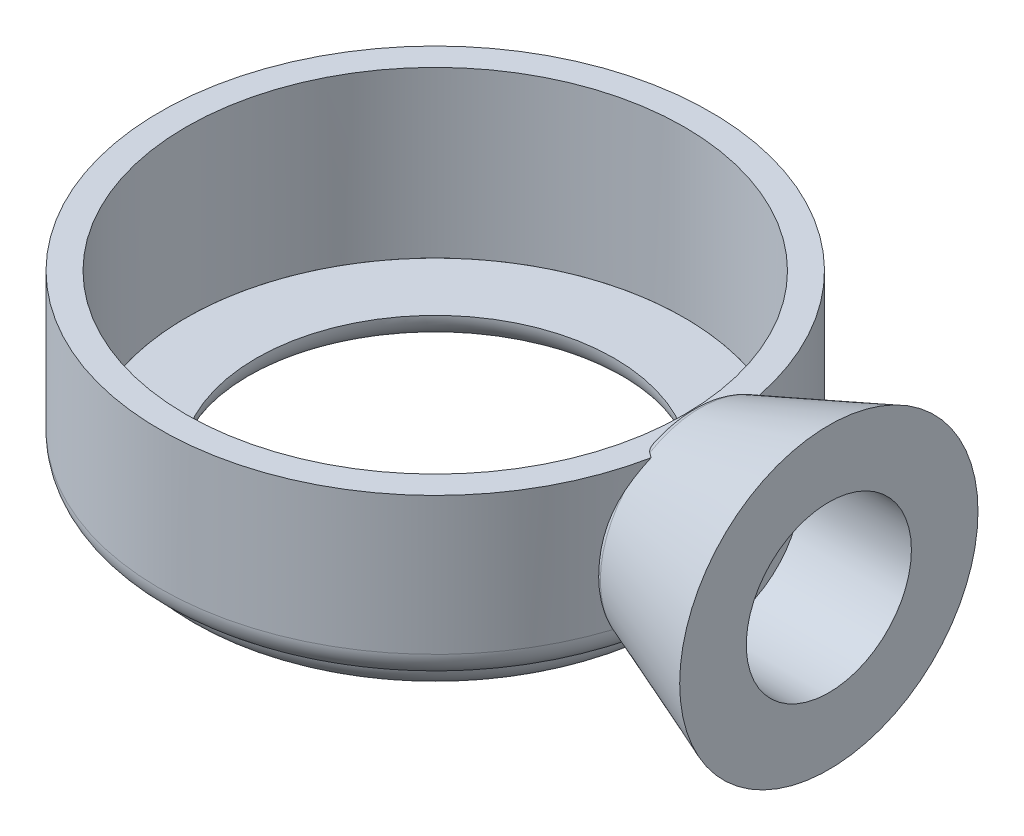
ISO-10303-21;
HEADER;
FILE_DESCRIPTION(('STEP AP214'),'2;1');
FILE_NAME('part.step','',(''),(''),'','','');
FILE_SCHEMA(('AUTOMOTIVE_DESIGN { 1 0 10303 214 1 1 1 1 }'));
ENDSEC;
DATA;
#1=APPLICATION_CONTEXT('core data for automotive mechanical design processes');
#2=APPLICATION_PROTOCOL_DEFINITION('international standard','automotive_design',2000,#1);
#3=PRODUCT_CONTEXT('',#1,'mechanical');
#4=PRODUCT('Part','Part','',(#3));
#5=PRODUCT_RELATED_PRODUCT_CATEGORY('part','',(#4));
#6=PRODUCT_DEFINITION_FORMATION('','',#4);
#7=PRODUCT_DEFINITION_CONTEXT('part definition',#1,'design');
#8=PRODUCT_DEFINITION('design','',#6,#7);
#9=PRODUCT_DEFINITION_SHAPE('','',#8);
#10=(LENGTH_UNIT() NAMED_UNIT(*) SI_UNIT(.MILLI.,.METRE.));
#11=(NAMED_UNIT(*) PLANE_ANGLE_UNIT() SI_UNIT($,.RADIAN.));
#12=(NAMED_UNIT(*) SI_UNIT($,.STERADIAN.) SOLID_ANGLE_UNIT());
#13=UNCERTAINTY_MEASURE_WITH_UNIT(LENGTH_MEASURE(1.E-05),#10,'distance_accuracy_value','');
#14=(GEOMETRIC_REPRESENTATION_CONTEXT(3) GLOBAL_UNCERTAINTY_ASSIGNED_CONTEXT((#13)) GLOBAL_UNIT_ASSIGNED_CONTEXT((#10,
#11,#12)) REPRESENTATION_CONTEXT('',''));
#15=CARTESIAN_POINT('',(0.,0.,0.));
#16=DIRECTION('',(0.,0.,1.));
#17=DIRECTION('',(1.,0.,0.));
#18=AXIS2_PLACEMENT_3D('',#15,#16,#17);
#19=CARTESIAN_POINT('',(0.,-1.,0.));
#20=DIRECTION('',(0.,1.,0.));
#21=DIRECTION('',(0.,0.,1.));
#22=AXIS2_PLACEMENT_3D('',#19,#20,#21);
#23=PLANE('',#22);
#24=CARTESIAN_POINT('',(0.,-1.,0.));
#25=DIRECTION('',(0.,1.,0.));
#26=DIRECTION('',(0.,0.,1.));
#27=AXIS2_PLACEMENT_3D('',#24,#25,#26);
#28=CIRCLE('',#27,8.05);
#29=CARTESIAN_POINT('',(0.,-1.,8.05));
#30=VERTEX_POINT('',#29);
#31=EDGE_CURVE('E11',#30,#30,#28,.F.);
#32=ORIENTED_EDGE('',*,*,#31,.T.);
#33=EDGE_LOOP('',(#32));
#34=FACE_BOUND('',#33,.T.);
#35=CARTESIAN_POINT('',(0.,-1.,0.));
#36=DIRECTION('',(0.,1.,0.));
#37=DIRECTION('',(0.,0.,1.));
#38=AXIS2_PLACEMENT_3D('',#35,#36,#37);
#39=CIRCLE('',#38,7.5);
#40=CARTESIAN_POINT('',(0.,-1.,7.5));
#41=VERTEX_POINT('',#40);
#42=EDGE_CURVE('E58',#41,#41,#39,.T.);
#43=ORIENTED_EDGE('',*,*,#42,.T.);
#44=EDGE_LOOP('',(#43));
#45=FACE_BOUND('',#44,.T.);
#46=ADVANCED_FACE('F51',(#34,#45),#23,.F.);
#47=CARTESIAN_POINT('',(0.,0.,0.));
#48=DIRECTION('',(0.,1.,0.));
#49=DIRECTION('',(0.,0.,1.));
#50=AXIS2_PLACEMENT_3D('',#47,#48,#49);
#51=PLANE('',#50);
#52=CARTESIAN_POINT('',(0.,0.,0.));
#53=DIRECTION('',(0.,1.,0.));
#54=DIRECTION('',(0.,0.,1.));
#55=AXIS2_PLACEMENT_3D('',#52,#53,#54);
#56=CIRCLE('',#55,6.5);
#57=CARTESIAN_POINT('',(0.,0.,6.5));
#58=VERTEX_POINT('',#57);
#59=EDGE_CURVE('E66',#58,#58,#56,.T.);
#60=ORIENTED_EDGE('',*,*,#59,.F.);
#61=EDGE_LOOP('',(#60));
#62=FACE_BOUND('',#61,.T.);
#63=CARTESIAN_POINT('',(0.,0.,0.));
#64=DIRECTION('',(0.,1.,0.));
#65=DIRECTION('',(0.,0.,1.));
#66=AXIS2_PLACEMENT_3D('',#63,#64,#65);
#67=CIRCLE('',#66,9.05);
#68=CARTESIAN_POINT('',(0.,0.,9.05));
#69=VERTEX_POINT('',#68);
#70=EDGE_CURVE('E62',#69,#69,#67,.T.);
#71=ORIENTED_EDGE('',*,*,#70,.T.);
#72=EDGE_LOOP('',(#71));
#73=FACE_BOUND('',#72,.T.);
#74=ADVANCED_FACE('F75',(#62,#73),#51,.T.);
#75=CARTESIAN_POINT('',(0.,0.,0.));
#76=DIRECTION('',(0.,1.,0.));
#77=DIRECTION('',(0.,0.,1.));
#78=AXIS2_PLACEMENT_3D('',#75,#76,#77);
#79=TOROIDAL_SURFACE('',#78,7.5,1.);
#80=ORIENTED_EDGE('',*,*,#59,.T.);
#81=EDGE_LOOP('',(#80));
#82=FACE_BOUND('',#81,.T.);
#83=ORIENTED_EDGE('',*,*,#42,.F.);
#84=EDGE_LOOP('',(#83));
#85=FACE_BOUND('',#84,.T.);
#86=ADVANCED_FACE('F72',(#82,#85),#79,.T.);
#87=CARTESIAN_POINT('',(0.,0.,0.));
#88=DIRECTION('',(0.,1.,0.));
#89=DIRECTION('',(0.,0.,1.));
#90=AXIS2_PLACEMENT_3D('',#87,#88,#89);
#91=TOROIDAL_SURFACE('',#90,8.05,1.);
#92=ORIENTED_EDGE('',*,*,#31,.F.);
#93=EDGE_LOOP('',(#92));
#94=FACE_BOUND('',#93,.T.);
#95=ORIENTED_EDGE('',*,*,#70,.F.);
#96=EDGE_LOOP('',(#95));
#97=FACE_BOUND('',#96,.T.);
#98=ADVANCED_FACE('F53',(#94,#97),#91,.T.);
#99=CLOSED_SHELL('',(#46,#74,#86,#98));
#100=MANIFOLD_SOLID_BREP('B2',#99);
#101=CARTESIAN_POINT('',(0.,0.998749217771909,0.));
#102=DIRECTION('',(0.,-1.,0.));
#103=DIRECTION('',(0.,0.,-1.));
#104=AXIS2_PLACEMENT_3D('',#101,#102,#103);
#105=TOROIDAL_SURFACE('',#104,9.,1.);
#106=CARTESIAN_POINT('',(0.,0.,0.));
#107=DIRECTION('',(0.,1.,0.));
#108=DIRECTION('',(0.,0.,1.));
#109=AXIS2_PLACEMENT_3D('',#106,#107,#108);
#110=CIRCLE('',#109,9.05);
#111=CARTESIAN_POINT('',(0.,0.,9.05));
#112=VERTEX_POINT('',#111);
#113=EDGE_CURVE('E214',#112,#112,#110,.T.);
#114=ORIENTED_EDGE('',*,*,#113,.T.);
#115=EDGE_LOOP('',(#114));
#116=FACE_BOUND('',#115,.T.);
#117=CARTESIAN_POINT('',(0.,0.998749217771908,0.));
#118=DIRECTION('',(0.,-1.,0.));
#119=DIRECTION('',(0.,0.,-1.));
#120=AXIS2_PLACEMENT_3D('',#117,#118,#119);
#121=CIRCLE('',#120,10.);
#122=CARTESIAN_POINT('',(9.52522837476844,0.998749217771908,-3.04467147792765));
#123=VERTEX_POINT('',#122);
#124=CARTESIAN_POINT('',(9.52522837476844,0.998749217771908,3.04467147792766));
#125=VERTEX_POINT('',#124);
#126=EDGE_CURVE('E142',#123,#125,#121,.F.);
#127=ORIENTED_EDGE('',*,*,#126,.F.);
#128=CARTESIAN_POINT('',(9.52522837476845,0.998749217771908,-3.04467147792766));
#129=CARTESIAN_POINT('',(9.5296911350641,0.970462280724586,-3.03070518458136));
#130=CARTESIAN_POINT('',(9.53320101055339,0.94256989780769,-3.01568182763804));
#131=CARTESIAN_POINT('',(9.53840573072436,0.8877157152806,-2.98379929425175));
#132=CARTESIAN_POINT('',(9.54010249221829,0.860752962123581,-2.96694207737544));
#133=CARTESIAN_POINT('',(9.541776699245,0.807967550509579,-2.93172511597069));
#134=CARTESIAN_POINT('',(9.54176244765662,0.782139994705117,-2.91337305924503));
#135=CARTESIAN_POINT('',(9.54015984619829,0.73159668001217,-2.87525757890278));
#136=CARTESIAN_POINT('',(9.53857100767021,0.70688126875645,-2.85549371891328));
#137=CARTESIAN_POINT('',(9.53148040426359,0.632850828439949,-2.79280660669356));
#138=CARTESIAN_POINT('',(9.52361048547211,0.585532128062656,-2.74774481940659));
#139=CARTESIAN_POINT('',(9.50331924772325,0.497139053581418,-2.65274850504697));
#140=CARTESIAN_POINT('',(9.49089170780334,0.456073323460673,-2.60280738656666));
#141=CARTESIAN_POINT('',(9.46070039317032,0.373167832845652,-2.48768337050314));
#142=CARTESIAN_POINT('',(9.4423644195133,0.332936831489556,-2.42148849724249));
#143=CARTESIAN_POINT('',(9.40602820076715,0.263044566039846,-2.28367267419903));
#144=CARTESIAN_POINT('',(9.38802802235708,0.233385380465129,-2.21205066074194));
#145=CARTESIAN_POINT('',(9.36269324513111,0.194272517948546,-2.0963717871404));
#146=CARTESIAN_POINT('',(9.35409108970284,0.18160393525064,-2.05363681187251));
#147=CARTESIAN_POINT('',(9.33855011538293,0.159033531163914,-1.96713339690613));
#148=CARTESIAN_POINT('',(9.33161159247918,0.149132202063674,-1.92336477482409));
#149=CARTESIAN_POINT('',(9.31970620391423,0.131730613925383,-1.83509695368141));
#150=CARTESIAN_POINT('',(9.31473932335708,0.124230336747227,-1.79059776014294));
#151=CARTESIAN_POINT('',(9.30692011206443,0.111248058907653,-1.70112286282741));
#152=CARTESIAN_POINT('',(9.30406779575058,0.105766072011401,-1.65614715580257));
#153=CARTESIAN_POINT('',(9.30151466019399,0.0991375600499061,-1.59177382343206));
#154=CARTESIAN_POINT('',(9.30094447557661,0.0973057758668365,-1.57247431353934));
#155=CARTESIAN_POINT('',(9.30018738884319,0.0939281882239854,-1.5338744646217));
#156=CARTESIAN_POINT('',(9.29999986242338,0.0923819226982977,-1.51457417840382));
#157=CARTESIAN_POINT('',(9.3,0.0909652486000718,-1.49526348770849));
#158=B_SPLINE_CURVE_WITH_KNOTS('',3,(#128,#129,#130,#131,#132,#133,#134,#135,#136,#137,#138,
#139,#140,#141,#142,#143,#144,#145,#146,#147,#148,#149,#150,#151,#152,#153,#154,#155,#156,#157),
.UNSPECIFIED.,.F.,.F.,(4,2,2,2,2,2,2,2,2,2,2,2,2,2,4),(0.,0.0955189277207961,0.190936773245916,
0.285891612004567,0.380875928328737,0.577564744825177,0.774523038693044,1.01236511680044,
1.25025393114839,1.38632799972278,1.52242626020082,1.65852349242325,1.79462165284029,
1.85280100083799,1.91088535355812),.UNSPECIFIED.);
#159=CARTESIAN_POINT('',(9.3,0.0909652486000553,-1.49526348770827));
#160=VERTEX_POINT('',#159);
#161=EDGE_CURVE('E349',#123,#160,#158,.T.);
#162=ORIENTED_EDGE('',*,*,#161,.T.);
#163=CARTESIAN_POINT('',(9.3,0.0448100163549631,0.));
#164=CARTESIAN_POINT('',(9.3,0.0448114613672878,0.166938584902347));
#165=CARTESIAN_POINT('',(9.3,0.0461906522423888,0.333876270208652));
#166=CARTESIAN_POINT('',(9.3,0.0521147214031834,0.667746854521476));
#167=CARTESIAN_POINT('',(9.3,0.0566604394240163,0.834679740509161));
#168=CARTESIAN_POINT('',(9.3,0.0701748728199107,1.16837494784625));
#169=CARTESIAN_POINT('',(9.3,0.0791435868087028,1.3351372692491));
#170=CARTESIAN_POINT('',(9.3,0.103725960682379,1.66814732317993));
#171=CARTESIAN_POINT('',(9.3,0.119336286461968,1.8343952718023));
#172=CARTESIAN_POINT('',(9.3,0.150578725175491,2.08314928276193));
#173=CARTESIAN_POINT('',(9.3,0.162330041665067,2.16613641013845));
#174=CARTESIAN_POINT('',(9.3,0.189170095853257,2.33161382876806));
#175=CARTESIAN_POINT('',(9.3,0.204260162086929,2.41410390877918));
#176=CARTESIAN_POINT('',(9.3,0.238710227597957,2.57829146854541));
#177=CARTESIAN_POINT('',(9.3,0.258074130571538,2.65998815193047));
#178=CARTESIAN_POINT('',(9.3,0.30235128751383,2.82180412171622));
#179=CARTESIAN_POINT('',(9.3,0.327259346520685,2.90192480885543));
#180=CARTESIAN_POINT('',(9.3,0.384828896513536,3.06028203612416));
#181=CARTESIAN_POINT('',(9.3,0.417555830426649,3.13849617652784));
#182=CARTESIAN_POINT('',(9.3,0.474677229661689,3.25154485400919));
#183=CARTESIAN_POINT('',(9.3,0.494995563666627,3.28842888365579));
#184=CARTESIAN_POINT('',(9.3,0.538909894094795,3.36017056499799));
#185=CARTESIAN_POINT('',(9.3,0.562501139552245,3.39503105186338));
#186=CARTESIAN_POINT('',(9.3,0.606177416677979,3.45189532966696));
#187=CARTESIAN_POINT('',(9.3,0.62525594402647,3.47466711584099));
#188=CARTESIAN_POINT('',(9.3,0.665750021120939,3.51811887923598));
#189=CARTESIAN_POINT('',(9.3,0.687168360201085,3.53879630189552));
#190=CARTESIAN_POINT('',(9.3,0.73283307953526,3.57735834295072));
#191=CARTESIAN_POINT('',(9.3,0.757107473418159,3.59521042966548));
#192=CARTESIAN_POINT('',(9.3,0.808350616309844,3.62651666664889));
#193=CARTESIAN_POINT('',(9.3,0.835311987773796,3.63998244824106));
#194=CARTESIAN_POINT('',(9.3,0.883549229067235,3.65801983557213));
#195=CARTESIAN_POINT('',(9.3,0.904284501318877,3.66402872327838));
#196=CARTESIAN_POINT('',(9.3,0.946469565201065,3.67248266848431));
#197=CARTESIAN_POINT('',(9.3,0.967918681057006,3.67493100371151));
#198=CARTESIAN_POINT('',(9.3,1.01096102585066,3.67602358584269));
#199=CARTESIAN_POINT('',(9.3,1.03255446280439,3.67465983554147));
#200=CARTESIAN_POINT('',(9.3,1.07518838521563,3.66825365375241));
#201=CARTESIAN_POINT('',(9.3,1.09622845223576,3.66320851695271));
#202=CARTESIAN_POINT('',(9.3,1.14195534423797,3.64835985910121));
#203=CARTESIAN_POINT('',(9.3,1.16637129951854,3.63773017397042));
#204=CARTESIAN_POINT('',(9.3,1.21315928779459,3.61267043268167));
#205=CARTESIAN_POINT('',(9.3,1.23552729107656,3.59823309195795));
#206=CARTESIAN_POINT('',(9.3,1.29004896009026,3.55771905171312));
#207=CARTESIAN_POINT('',(9.3,1.32070095354356,3.52964211598568));
#208=CARTESIAN_POINT('',(9.3,1.37751946912337,3.46930425097217));
#209=CARTESIAN_POINT('',(9.3,1.40367440166041,3.4370328765826));
#210=CARTESIAN_POINT('',(9.3,1.45187103591682,3.37038058286995));
#211=CARTESIAN_POINT('',(9.3,1.47397192988753,3.33604175087121));
#212=CARTESIAN_POINT('',(9.3,1.51522657406514,3.26561857427138));
#213=CARTESIAN_POINT('',(9.3,1.53437730820791,3.22953249226274));
#214=CARTESIAN_POINT('',(9.3,1.57025565318725,3.15609002994308));
#215=CARTESIAN_POINT('',(9.3,1.58697784059428,3.11873102969064));
#216=CARTESIAN_POINT('',(9.3,1.61833498821669,3.04317764131696));
#217=CARTESIAN_POINT('',(9.3,1.63297093802631,3.00498365924737));
#218=CARTESIAN_POINT('',(9.3,1.66957929870463,2.90251006306371));
#219=CARTESIAN_POINT('',(9.3,1.69000479931704,2.8376787630859));
#220=CARTESIAN_POINT('',(9.3,1.72707020871684,2.70693009102029));
#221=CARTESIAN_POINT('',(9.3,1.74370785576231,2.64101209511973));
#222=CARTESIAN_POINT('',(9.3,1.77396860827063,2.50835917348358));
#223=CARTESIAN_POINT('',(9.3,1.78758571449204,2.4416228949365));
#224=CARTESIAN_POINT('',(9.3,1.81233095271113,2.30768614709502));
#225=CARTESIAN_POINT('',(9.3,1.82345863856643,2.24048559681706));
#226=CARTESIAN_POINT('',(9.3,1.85388397423464,2.03779213660974));
#227=CARTESIAN_POINT('',(9.3,1.87009000688177,1.90183717721459));
#228=CARTESIAN_POINT('',(9.3,1.89683560383719,1.62957192019261));
#229=CARTESIAN_POINT('',(9.3,1.90738162564452,1.49326220656021));
#230=CARTESIAN_POINT('',(9.3,1.92208594162326,1.25875603845658));
#231=CARTESIAN_POINT('',(9.3,1.92720651587373,1.16061735318356));
#232=CARTESIAN_POINT('',(9.3,1.93581764002215,0.964267206497224));
#233=CARTESIAN_POINT('',(9.3,1.93930813771314,0.8660557428539));
#234=CARTESIAN_POINT('',(9.3,1.9478489489295,0.571282157043947));
#235=CARTESIAN_POINT('',(9.3,1.9509639704759,0.374664265103708));
#236=CARTESIAN_POINT('',(9.3,1.95333365067564,-0.0179096439895697));
#237=CARTESIAN_POINT('',(9.3,1.95260154584395,-0.213865612422478));
#238=CARTESIAN_POINT('',(9.3,1.94700596141454,-0.60567289920913));
#239=CARTESIAN_POINT('',(9.3,1.94214373580763,-0.80152423127405));
#240=CARTESIAN_POINT('',(9.3,1.92894032491445,-1.12904945376294));
#241=CARTESIAN_POINT('',(9.3,1.92225452831498,-1.26078774287685));
#242=CARTESIAN_POINT('',(9.3,1.90505937686095,-1.52408445953294));
#243=CARTESIAN_POINT('',(9.3,1.89454844531627,-1.65564279042004));
#244=CARTESIAN_POINT('',(9.3,1.86811902548526,-1.91860540050852));
#245=CARTESIAN_POINT('',(9.3,1.85218539179147,-2.05000820248137));
#246=CARTESIAN_POINT('',(9.3,1.81263812479578,-2.3116161941235));
#247=CARTESIAN_POINT('',(9.3,1.78903190072534,-2.44182241506494));
#248=CARTESIAN_POINT('',(9.3,1.74493432304501,-2.63587757559557));
#249=CARTESIAN_POINT('',(9.3,1.72868086312768,-2.70068305236516));
#250=CARTESIAN_POINT('',(9.3,1.69250982359783,-2.82934889824016));
#251=CARTESIAN_POINT('',(9.3,1.67258894159944,-2.89320835904243));
#252=CARTESIAN_POINT('',(9.3,1.62823931875215,-3.01896842888375));
#253=CARTESIAN_POINT('',(9.3,1.60383618352401,-3.08087793548335));
#254=CARTESIAN_POINT('',(9.3,1.54909215058138,-3.20196855330588));
#255=CARTESIAN_POINT('',(9.3,1.51876407836456,-3.26115522259916));
#256=CARTESIAN_POINT('',(9.3,1.46008801170046,-3.35815796294711));
#257=CARTESIAN_POINT('',(9.3,1.43374288325924,-3.39717181612626));
#258=CARTESIAN_POINT('',(9.3,1.37597993434771,-3.47127515306227));
#259=CARTESIAN_POINT('',(9.3,1.34457533160316,-3.50637446969961));
#260=CARTESIAN_POINT('',(9.3,1.28964493852713,-3.55697309337172));
#261=CARTESIAN_POINT('',(9.3,1.26812327957113,-3.57463103651398));
#262=CARTESIAN_POINT('',(9.3,1.22275315289506,-3.60669172497592));
#263=CARTESIAN_POINT('',(9.3,1.19890746025231,-3.62109828613418));
#264=CARTESIAN_POINT('',(9.3,1.15363665687864,-3.64323740295839));
#265=CARTESIAN_POINT('',(9.3,1.13257862269514,-3.65171132526522));
#266=CARTESIAN_POINT('',(9.3,1.08934467516601,-3.66504334154203));
#267=CARTESIAN_POINT('',(9.3,1.06717003374694,-3.66990545449934));
#268=CARTESIAN_POINT('',(9.3,1.0221680303572,-3.67554312574215));
#269=CARTESIAN_POINT('',(9.3,0.999337718205447,-3.67629574561152));
#270=CARTESIAN_POINT('',(9.3,0.953930973928696,-3.6735637896852));
#271=CARTESIAN_POINT('',(9.3,0.931354621315654,-3.67007792219068));
#272=CARTESIAN_POINT('',(9.3,0.888943683955149,-3.65968835968211));
#273=CARTESIAN_POINT('',(9.3,0.869034324235252,-3.65308075496273));
#274=CARTESIAN_POINT('',(9.3,0.830368013672152,-3.63711097453117));
#275=CARTESIAN_POINT('',(9.3,0.811611478039474,-3.62774781330203));
#276=CARTESIAN_POINT('',(9.3,0.763706109395338,-3.60003584411251));
#277=CARTESIAN_POINT('',(9.3,0.73565950696052,-3.57978706812167));
#278=CARTESIAN_POINT('',(9.3,0.682998654687116,-3.53523225542288));
#279=CARTESIAN_POINT('',(9.3,0.658395524150719,-3.51091360758104));
#280=CARTESIAN_POINT('',(9.3,0.593610776697575,-3.43892088573872));
#281=CARTESIAN_POINT('',(9.3,0.556840544918195,-3.3882104547577));
#282=CARTESIAN_POINT('',(9.3,0.490622110252698,-3.28230027789216));
#283=CARTESIAN_POINT('',(9.3,0.46119391962015,-3.227088794707));
#284=CARTESIAN_POINT('',(9.3,0.395503292299706,-3.08799876914017));
#285=CARTESIAN_POINT('',(9.3,0.362366511340306,-3.00266258878508));
#286=CARTESIAN_POINT('',(9.3,0.304182751425483,-2.82921961225658));
#287=CARTESIAN_POINT('',(9.3,0.279154198913781,-2.74110699781099));
#288=CARTESIAN_POINT('',(9.3,0.234972962167329,-2.56298962320677));
#289=CARTESIAN_POINT('',(9.3,0.21584965747601,-2.47297770932772));
#290=CARTESIAN_POINT('',(9.3,0.182178599268304,-2.29222061369454));
#291=CARTESIAN_POINT('',(9.3,0.167626327040973,-2.20147624763485));
#292=CARTESIAN_POINT('',(9.3,0.142541750909981,-2.02316151636166));
#293=CARTESIAN_POINT('',(9.3,0.131871400351763,-1.93561014642944));
#294=CARTESIAN_POINT('',(9.3,0.113080748216141,-1.76023047375185));
#295=CARTESIAN_POINT('',(9.3,0.104960734996282,-1.6724021408244));
#296=CARTESIAN_POINT('',(9.3,0.083598865779837,-1.40856628089771));
#297=CARTESIAN_POINT('',(9.3,0.0733691977180748,-1.23231821986229));
#298=CARTESIAN_POINT('',(9.3,0.0580570632897703,-0.880058995790404));
#299=CARTESIAN_POINT('',(9.3,0.0529622055289206,-0.70404829104486));
#300=CARTESIAN_POINT('',(9.3,0.046338548588872,-0.352024709090196));
#301=CARTESIAN_POINT('',(9.3,0.0448084928048549,-0.176011854524468));
#302=CARTESIAN_POINT('',(9.3,0.0448100163549631,0.));
#303=B_SPLINE_CURVE_WITH_KNOTS('',3,(#163,#164,#165,#166,#167,#168,#169,#170,#171,#172,#173,
#174,#175,#176,#177,#178,#179,#180,#181,#182,#183,#184,#185,#186,#187,#188,#189,#190,#191,#192,
#193,#194,#195,#196,#197,#198,#199,#200,#201,#202,#203,#204,#205,#206,#207,#208,#209,#210,#211,
#212,#213,#214,#215,#216,#217,#218,#219,#220,#221,#222,#223,#224,#225,#226,#227,#228,#229,#230,
#231,#232,#233,#234,#235,#236,#237,#238,#239,#240,#241,#242,#243,#244,#245,#246,#247,#248,#249,
#250,#251,#252,#253,#254,#255,#256,#257,#258,#259,#260,#261,#262,#263,#264,#265,#266,#267,#268,
#269,#270,#271,#272,#273,#274,#275,#276,#277,#278,#279,#280,#281,#282,#283,#284,#285,#286,#287,
#288,#289,#290,#291,#292,#293,#294,#295,#296,#297,#298,#299,#300,#301,#302),.UNSPECIFIED.,.T.,
.F.,(4,2,2,2,2,2,2,2,2,2,2,2,2,2,2,2,2,2,2,2,2,2,2,2,2,2,2,2,2,2,2,2,2,2,2,2,2,2,2,2,2,2,2,2,2,
2,2,2,2,2,2,2,2,2,2,2,2,2,2,2,2,2,2,2,2,2,2,2,2,4),(0.,0.500808247283984,1.00174935509426,
1.50269030589809,2.00338007928761,2.25477384078621,2.50626781584785,2.75799246167217,
3.00948222310486,3.2631555948227,3.38936386721104,3.51539081583504,3.60438775621679,
3.69349197383146,3.78355735009805,3.87338191480942,3.93787752855503,4.00231373209392,
4.06688521487692,4.13150419665195,4.21094909545268,4.29054709983766,4.41454757594186,
4.53886297953527,4.66118644399365,4.78363414625838,4.90635122705597,5.0290099026423,
5.23276186093021,5.43663516306597,5.64090983252916,5.84522108187614,6.25577138394929,
6.66585228860066,6.9606531374117,7.25546342725292,7.84533457383526,8.43317752731313,
9.02084206318007,9.41652955938386,9.81238033989526,10.2093459159804,10.605929285494,
10.8062892834929,11.0068305890725,11.2062600188296,11.4052624408972,11.5462174687907,
11.68681005551,11.7701126164816,11.8533168987825,11.9211444455821,11.9888964047626,
12.0570261589393,12.1251766811817,12.1878690844537,12.2505839367908,12.3537592928365,
12.4572604830861,12.6441172546312,12.8314779113555,13.1054158172923,13.3799719665126,
13.655872851182,13.9315001283477,14.1960509622398,14.4606316971918,14.9901264364196,
15.5183403099108,16.0463679580256),.UNSPECIFIED.);
#304=CARTESIAN_POINT('',(9.3,0.0909652486019285,1.49526348773381));
#305=VERTEX_POINT('',#304);
#306=EDGE_CURVE('E211',#160,#305,#303,.T.);
#307=ORIENTED_EDGE('',*,*,#306,.T.);
#308=CARTESIAN_POINT('',(9.3,0.0909652486106346,1.49526348772912));
#309=CARTESIAN_POINT('',(9.2999985162628,0.093130696834383,1.52476069581307));
#310=CARTESIAN_POINT('',(9.30043735850997,0.0955961724024988,1.55423452489594));
#311=CARTESIAN_POINT('',(9.30221071942979,0.101215492719657,1.61309630897413));
#312=CARTESIAN_POINT('',(9.30354545706879,0.10436950562734,1.64248424121132));
#313=CARTESIAN_POINT('',(9.30892155394335,0.115006605240801,1.7305340004845));
#314=CARTESIAN_POINT('',(9.31433490363548,0.123658296944864,1.78898573216646));
#315=CARTESIAN_POINT('',(9.32861837532561,0.144885704742552,1.90471076100825));
#316=CARTESIAN_POINT('',(9.33748627321182,0.157458895055513,1.96198479147));
#317=CARTESIAN_POINT('',(9.35803782167886,0.187369455159854,2.07471391523823));
#318=CARTESIAN_POINT('',(9.36971851969511,0.204701831945188,2.1301708470406));
#319=CARTESIAN_POINT('',(9.39158444664334,0.239672638608034,2.2247616455561));
#320=CARTESIAN_POINT('',(9.4013860268451,0.25609481334669,2.26443714579189));
#321=CARTESIAN_POINT('',(9.42135476444891,0.29212776792703,2.34222909533616));
#322=CARTESIAN_POINT('',(9.43152195733668,0.311738857933112,2.38034539253963));
#323=CARTESIAN_POINT('',(9.45154283481476,0.354151687601063,2.45471506701524));
#324=CARTESIAN_POINT('',(9.46139725894157,0.37694508549749,2.49097298644918));
#325=CARTESIAN_POINT('',(9.48015319807472,0.42568807521551,2.56156484224339));
#326=CARTESIAN_POINT('',(9.48905456481361,0.451638156785945,2.59589847884756));
#327=CARTESIAN_POINT('',(9.51085542739742,0.525518784179097,2.68553844441592));
#328=CARTESIAN_POINT('',(9.52226876291395,0.576249443307475,2.73894759991681));
#329=CARTESIAN_POINT('',(9.53780967090854,0.684904517053094,2.83902285711034));
#330=CARTESIAN_POINT('',(9.54194949660708,0.742816656894035,2.88570017746218));
#331=CARTESIAN_POINT('',(9.54132439027231,0.834695188537658,2.95009087262068));
#332=CARTESIAN_POINT('',(9.53991378165632,0.866591227615733,2.97084081667231));
#333=CARTESIAN_POINT('',(9.53453269202365,0.931714636925241,3.00977996360124));
#334=CARTESIAN_POINT('',(9.53056117537427,0.964942540662884,3.0279681268656));
#335=CARTESIAN_POINT('',(9.52522837476846,0.998749217771956,3.04467147792759));
#336=B_SPLINE_CURVE_WITH_KNOTS('',3,(#308,#309,#310,#311,#312,#313,#314,#315,#316,#317,#318,
#319,#320,#321,#322,#323,#324,#325,#326,#327,#328,#329,#330,#331,#332,#333,#334,#335),
.UNSPECIFIED.,.F.,.F.,(4,2,2,2,2,2,2,2,2,2,2,2,2,4),(0.,0.0887207699622876,0.177463232122193,
0.35523616927218,0.532894841071766,0.710367833293065,0.842368880635156,0.974382774521658,
1.10605690072406,1.23775148184145,1.46042535068346,1.68272373400379,1.79678357384291,
1.91088956850025),.UNSPECIFIED.);
#337=EDGE_CURVE('E136',#305,#125,#336,.T.);
#338=ORIENTED_EDGE('',*,*,#337,.T.);
#339=EDGE_LOOP('',(#127,#162,#307,#338));
#340=FACE_BOUND('',#339,.T.);
#341=ADVANCED_FACE('F121',(#116,#340),#105,.T.);
#342=CARTESIAN_POINT('',(0.,6.,0.));
#343=DIRECTION('',(0.,1.,0.));
#344=DIRECTION('',(0.,0.,1.));
#345=AXIS2_PLACEMENT_3D('',#342,#343,#344);
#346=PLANE('',#345);
#347=CARTESIAN_POINT('',(0.,6.,0.));
#348=DIRECTION('',(0.,1.,0.));
#349=DIRECTION('',(0.,0.,1.));
#350=AXIS2_PLACEMENT_3D('',#347,#348,#349);
#351=CIRCLE('',#350,9.05);
#352=CARTESIAN_POINT('',(0.,6.,9.05));
#353=VERTEX_POINT('',#352);
#354=EDGE_CURVE('E207',#353,#353,#351,.T.);
#355=ORIENTED_EDGE('',*,*,#354,.F.);
#356=EDGE_LOOP('',(#355));
#357=FACE_BOUND('',#356,.T.);
#358=CARTESIAN_POINT('',(9.8054501946039,6.,1.96294332091945));
#359=CARTESIAN_POINT('',(9.76208433114538,6.,1.93161298722693));
#360=CARTESIAN_POINT('',(9.71896911005736,6.,1.89993230757133));
#361=CARTESIAN_POINT('',(9.63334248261127,6.,1.83580326647452));
#362=CARTESIAN_POINT('',(9.59083082722765,6.,1.80335523728934));
#363=CARTESIAN_POINT('',(9.50647479051429,6.,1.73759640433727));
#364=CARTESIAN_POINT('',(9.4646304415111,6.,1.70428555897658));
#365=CARTESIAN_POINT('',(9.38170747298233,6.,1.63668938364872));
#366=CARTESIAN_POINT('',(9.34062918709402,6.,1.60240364478186));
#367=CARTESIAN_POINT('',(9.3,6.,1.56758797246561));
#368=B_SPLINE_CURVE_WITH_KNOTS('',3,(#358,#359,#360,#361,#362,#363,#364,#365,#366,#367),
.UNSPECIFIED.,.F.,.F.,(4,2,2,2,4),(0.,0.160499378852749,0.32093049114692,0.481369351796566,
0.641876527922941),.UNSPECIFIED.);
#369=CARTESIAN_POINT('',(9.8054501946039,6.,1.96294332091945));
#370=VERTEX_POINT('',#369);
#371=CARTESIAN_POINT('',(9.62081602522373,6.,1.82607394319484));
#372=VERTEX_POINT('',#371);
#373=EDGE_CURVE('E190',#370,#372,#368,.T.);
#374=ORIENTED_EDGE('',*,*,#373,.T.);
#375=CARTESIAN_POINT('',(9.62081602522735,6.00000000000424,1.82607394319022));
#376=CARTESIAN_POINT('',(9.60781986140905,6.00000000000156,1.81616770506613));
#377=CARTESIAN_POINT('',(9.59547111685951,6.00000000000043,1.80547618098267));
#378=CARTESIAN_POINT('',(9.57202906278206,5.99999999999958,1.78286860356576));
#379=CARTESIAN_POINT('',(9.56093140637087,5.99999999999985,1.77095708299658));
#380=CARTESIAN_POINT('',(9.52975813414182,6.00000000000029,1.73430164401512));
#381=CARTESIAN_POINT('',(9.51127680120098,6.00000000000007,1.70820449961153));
#382=CARTESIAN_POINT('',(9.48127910076978,5.99999999999995,1.65930478478683));
#383=CARTESIAN_POINT('',(9.46910884213106,5.99999999999999,1.63688461942233));
#384=CARTESIAN_POINT('',(9.4467267842499,6.00000000000002,1.59107953870391));
#385=CARTESIAN_POINT('',(9.43651576352497,6.,1.56769424431524));
#386=CARTESIAN_POINT('',(9.41755130814909,6.,1.51972265876923));
#387=CARTESIAN_POINT('',(9.40883714232262,6.,1.49512109398963));
#388=CARTESIAN_POINT('',(9.39290307091028,6.,1.44545717030785));
#389=CARTESIAN_POINT('',(9.38568248955338,6.,1.42039502540818));
#390=CARTESIAN_POINT('',(9.36814883337812,6.,1.35325248381728));
#391=CARTESIAN_POINT('',(9.35894993471525,6.,1.31088191870991));
#392=CARTESIAN_POINT('',(9.34324749248058,6.,1.22563540365105));
#393=CARTESIAN_POINT('',(9.33674590872093,6.,1.18275910942816));
#394=CARTESIAN_POINT('',(9.32029355878249,6.,1.0534150183435));
#395=CARTESIAN_POINT('',(9.31346934451184,6.,0.966560080034023));
#396=CARTESIAN_POINT('',(9.30490755113543,6.,0.801432210357178));
#397=CARTESIAN_POINT('',(9.30272770444107,6.,0.723174012883369));
#398=CARTESIAN_POINT('',(9.30089459095655,6.,0.60612325043231));
#399=CARTESIAN_POINT('',(9.30052145821818,6.,0.567341168771032));
#400=CARTESIAN_POINT('',(9.30007655381791,6.,0.489783814059453));
#401=CARTESIAN_POINT('',(9.3000047141589,6.,0.451008541447988));
#402=CARTESIAN_POINT('',(9.3,6.,0.412234733285877));
#403=B_SPLINE_CURVE_WITH_KNOTS('',3,(#375,#376,#377,#378,#379,#380,#381,#382,#383,#384,#385,
#386,#387,#388,#389,#390,#391,#392,#393,#394,#395,#396,#397,#398,#399,#400,#401,#402),
.UNSPECIFIED.,.F.,.F.,(4,2,2,2,2,2,2,2,2,2,2,2,2,4),(0.,0.0489331391062964,0.0976906492000629,
0.193198061661711,0.269638338955371,0.346108927733394,0.424351925407813,0.502559444294965,
0.632504412663021,0.762543631648788,1.02362605750022,1.25847061143178,1.37482063697125,
1.49114440273137),.UNSPECIFIED.);
#404=CARTESIAN_POINT('',(9.3,6.,0.412234733285877));
#405=VERTEX_POINT('',#404);
#406=EDGE_CURVE('E262',#372,#405,#403,.T.);
#407=ORIENTED_EDGE('',*,*,#406,.T.);
#408=DIRECTION('',(0.,0.,-1.));
#409=VECTOR('',#408,1.);
#410=CARTESIAN_POINT('',(9.3,6.,0.));
#411=LINE('',#410,#409);
#412=CARTESIAN_POINT('',(9.3,6.,-0.412234733285877));
#413=VERTEX_POINT('',#412);
#414=EDGE_CURVE('E202',#405,#413,#411,.T.);
#415=ORIENTED_EDGE('',*,*,#414,.T.);
#416=CARTESIAN_POINT('',(9.3,6.,-0.412234733285877));
#417=CARTESIAN_POINT('',(9.30000677444647,6.,-0.452929203264786));
#418=CARTESIAN_POINT('',(9.30008480979659,6.,-0.493624500601454));
#419=CARTESIAN_POINT('',(9.30058182326871,6.,-0.575024299626389));
#420=CARTESIAN_POINT('',(9.30100089825833,6.,-0.615728800644486));
#421=CARTESIAN_POINT('',(9.30238589611464,6.,-0.69756052575253));
#422=CARTESIAN_POINT('',(9.30335753762048,6.,-0.738687682267676));
#423=CARTESIAN_POINT('',(9.3061157226136,6.,-0.820905738444966));
#424=CARTESIAN_POINT('',(9.30790217617572,6.,-0.861996641606873));
#425=CARTESIAN_POINT('',(9.31512625507824,6.,-0.989020385566916));
#426=CARTESIAN_POINT('',(9.32242050967596,6.,-1.07489106825315));
#427=CARTESIAN_POINT('',(9.33969807578868,6.,-1.20267145244154));
#428=CARTESIAN_POINT('',(9.34649214452623,6.,-1.2450049366414));
#429=CARTESIAN_POINT('',(9.36282128779406,6.,-1.32913132641499));
#430=CARTESIAN_POINT('',(9.37235426027142,6.,-1.37092462096555));
#431=CARTESIAN_POINT('',(9.38923722097435,6.,-1.43263438565516));
#432=CARTESIAN_POINT('',(9.39524965179556,6.,-1.45291621131865));
#433=CARTESIAN_POINT('',(9.40826335947901,6.,-1.49316611734113));
#434=CARTESIAN_POINT('',(9.41526507013865,6.,-1.51313405576974));
#435=CARTESIAN_POINT('',(9.43791494930852,6.,-1.57231180136565));
#436=CARTESIAN_POINT('',(9.45524143891149,6.,-1.61092551793127));
#437=CARTESIAN_POINT('',(9.49036428575184,6.,-1.67523151529997));
#438=CARTESIAN_POINT('',(9.50683091741677,6.,-1.70164531257432));
#439=CARTESIAN_POINT('',(9.54355130506199,6.,-1.75163810718319));
#440=CARTESIAN_POINT('',(9.56378476318672,6.,-1.77523123437863));
#441=CARTESIAN_POINT('',(9.59719709126501,6.,-1.80696073253885));
#442=CARTESIAN_POINT('',(9.60872980998495,6.,-1.81685532670537));
#443=CARTESIAN_POINT('',(9.62081602522401,6.,-1.82607394320126));
#444=B_SPLINE_CURVE_WITH_KNOTS('',3,(#416,#417,#418,#419,#420,#421,#422,#423,#424,#425,#426,
#427,#428,#429,#430,#431,#432,#433,#434,#435,#436,#437,#438,#439,#440,#441,#442,#443),
.UNSPECIFIED.,.F.,.F.,(4,2,2,2,2,2,2,2,2,2,2,2,2,4),(0.,0.122084340424548,0.244203369338864,
0.367609854730604,0.491002723897538,0.749223360163579,0.877787455612589,1.00625314310914,
1.06969173523857,1.13315823190838,1.25969014640893,1.35284272523208,1.44550715654832,
1.49104077267409),.UNSPECIFIED.);
#445=CARTESIAN_POINT('',(9.62081602522721,6.,-1.82607394319797));
#446=VERTEX_POINT('',#445);
#447=EDGE_CURVE('E200',#413,#446,#444,.T.);
#448=ORIENTED_EDGE('',*,*,#447,.T.);
#449=CARTESIAN_POINT('',(12.9939184228923,6.,-3.79390122739072));
#450=CARTESIAN_POINT('',(12.8326242993698,6.,-3.71361948582547));
#451=CARTESIAN_POINT('',(12.6717191879824,6.,-3.63254292685224));
#452=CARTESIAN_POINT('',(12.3509313184764,6.,-3.46841404479338));
#453=CARTESIAN_POINT('',(12.1910485081712,6.,-3.38536182359969));
#454=CARTESIAN_POINT('',(11.8730062785359,6.,-3.2171376817312));
#455=CARTESIAN_POINT('',(11.7148431492832,6.,-3.13197279511161));
#456=CARTESIAN_POINT('',(11.4000832041782,6.,-2.9587312329762));
#457=CARTESIAN_POINT('',(11.2434866256117,6.,-2.87065412479034));
#458=CARTESIAN_POINT('',(10.9320812006174,6.,-2.69069629892691));
#459=CARTESIAN_POINT('',(10.7772764255633,6.,-2.59880851379035));
#460=CARTESIAN_POINT('',(10.470567502526,6.,-2.41040204418966));
#461=CARTESIAN_POINT('',(10.3186622234631,6.,-2.31388521932947));
#462=CARTESIAN_POINT('',(10.0936410391918,6.,-2.16433497521489));
#463=CARTESIAN_POINT('',(10.0189931816027,6.,-2.11360663900874));
#464=CARTESIAN_POINT('',(9.87097146475097,6.,-2.01033771607749));
#465=CARTESIAN_POINT('',(9.79759745482714,6.,-1.95779734589182));
#466=CARTESIAN_POINT('',(9.65231351671442,6.,-1.85051869118629));
#467=CARTESIAN_POINT('',(9.58040566107668,6.,-1.79577758192325));
#468=CARTESIAN_POINT('',(9.43858394921955,6.,-1.68371759405349));
#469=CARTESIAN_POINT('',(9.36867092832627,6.,-1.62639766073365));
#470=CARTESIAN_POINT('',(9.3,6.,-1.56758797246561));
#471=B_SPLINE_CURVE_WITH_KNOTS('',3,(#449,#450,#451,#452,#453,#454,#455,#456,#457,#458,#459,
#460,#461,#462,#463,#464,#465,#466,#467,#468,#469,#470),.UNSPECIFIED.,.F.,.F.,(4,2,2,2,2,2,2,2,
2,2,4),(0.,0.540514394008006,1.08100097194408,1.61988107361926,2.15884159990788,
2.69885081498501,3.23864488247251,3.50938320791206,3.78008929126075,4.05115468452667,
4.32233196695587),.UNSPECIFIED.);
#472=CARTESIAN_POINT('',(9.80545019460389,6.00000000000256,-1.96294332091536));
#473=VERTEX_POINT('',#472);
#474=EDGE_CURVE('E184',#446,#473,#471,.F.);
#475=ORIENTED_EDGE('',*,*,#474,.T.);
#476=CARTESIAN_POINT('',(0.,6.,0.));
#477=DIRECTION('',(0.,1.,0.));
#478=DIRECTION('',(0.,0.,1.));
#479=AXIS2_PLACEMENT_3D('',#476,#477,#478);
#480=CIRCLE('',#479,10.);
#481=EDGE_CURVE('E196',#473,#370,#480,.T.);
#482=ORIENTED_EDGE('',*,*,#481,.T.);
#483=EDGE_LOOP('',(#374,#407,#415,#448,#475,#482));
#484=FACE_BOUND('',#483,.T.);
#485=ADVANCED_FACE('F195',(#357,#484),#346,.T.);
#486=CARTESIAN_POINT('',(0.,6.,0.));
#487=DIRECTION('',(0.,-1.,0.));
#488=DIRECTION('',(0.,0.,-1.));
#489=AXIS2_PLACEMENT_3D('',#486,#487,#488);
#490=CYLINDRICAL_SURFACE('',#489,10.);
#491=CARTESIAN_POINT('',(9.88023701662835,6.25856896919628,1.54302187127951));
#492=CARTESIAN_POINT('',(9.86761177578697,6.21641537168759,1.62387997911151));
#493=CARTESIAN_POINT('',(9.8542475513316,6.1711068114592,1.70292384565593));
#494=CARTESIAN_POINT('',(9.82636859049811,6.07455585909293,1.85704080138826));
#495=CARTESIAN_POINT('',(9.81185435911986,6.02331606701659,1.93211560961653));
#496=CARTESIAN_POINT('',(9.76713572696425,5.86147907710259,2.15060569600604));
#497=CARTESIAN_POINT('',(9.73568784711344,5.74254601990995,2.28770125406497));
#498=CARTESIAN_POINT('',(9.66920555577425,5.47338992627687,2.55484784861425));
#499=CARTESIAN_POINT('',(9.63411753414929,5.32125615576358,2.68294728927513));
#500=CARTESIAN_POINT('',(9.56679343684624,4.99803701946067,2.91392844837438));
#501=CARTESIAN_POINT('',(9.5345602566482,4.82693280031461,3.01678474736296));
#502=CARTESIAN_POINT('',(9.48982129402214,4.55321979534197,3.15369605432326));
#503=CARTESIAN_POINT('',(9.47510785385547,4.45572192621342,3.19751413446035));
#504=CARTESIAN_POINT('',(9.44787293036563,4.25721286881511,3.27711313191735));
#505=CARTESIAN_POINT('',(9.43535072236118,4.15620285537479,3.31289670751019));
#506=CARTESIAN_POINT('',(9.41288096103856,3.9513569534474,3.37621103636673));
#507=CARTESIAN_POINT('',(9.40293335865159,3.84752111885869,3.40374194691761));
#508=CARTESIAN_POINT('',(9.38592413569543,3.63778064788179,3.45036879469238));
#509=CARTESIAN_POINT('',(9.378861375957,3.53187684543812,3.46946806165241));
#510=CARTESIAN_POINT('',(9.36783397521409,3.31857976908566,3.49913390809413));
#511=CARTESIAN_POINT('',(9.36387337278842,3.21118473819653,3.50968936531476));
#512=CARTESIAN_POINT('',(9.35919430818714,2.99586344747614,3.52214799174012));
#513=CARTESIAN_POINT('',(9.35847462991067,2.88793740211969,3.52405440635085));
#514=CARTESIAN_POINT('',(9.3602981556413,2.67222515747195,3.51920800553171));
#515=CARTESIAN_POINT('',(9.36284386691633,2.56443912932875,3.512448536168));
#516=CARTESIAN_POINT('',(9.37111848826163,2.34992066342431,3.49031195361814));
#517=CARTESIAN_POINT('',(9.37684616056552,2.24318783239557,3.47493819132742));
#518=CARTESIAN_POINT('',(9.39087807089571,2.03767762785492,3.43682922973793));
#519=CARTESIAN_POINT('',(9.39901277618819,1.93879901865477,3.41457503617494));
#520=CARTESIAN_POINT('',(9.41771217373324,1.74324273085751,3.3626561212312));
#521=CARTESIAN_POINT('',(9.4282768316566,1.64656502118837,3.33299150454081));
#522=CARTESIAN_POINT('',(9.45154625457299,1.45602731797855,3.26642363844155));
#523=CARTESIAN_POINT('',(9.46425051892808,1.36216667132383,3.22952208204377));
#524=CARTESIAN_POINT('',(9.49145155218463,1.17780121773222,3.14867194157387));
#525=CARTESIAN_POINT('',(9.50594830104487,1.08729637328987,3.10472343628985));
#526=CARTESIAN_POINT('',(9.52116677996666,0.998749217771909,3.05734903929194));
#527=B_SPLINE_CURVE_WITH_KNOTS('',3,(#491,#492,#493,#494,#495,#496,#497,#498,#499,#500,#501,
#502,#503,#504,#505,#506,#507,#508,#509,#510,#511,#512,#513,#514,#515,#516,#517,#518,#519,#520,
#521,#522,#523,#524,#525,#526),.UNSPECIFIED.,.F.,.F.,(4,2,2,2,2,2,2,2,2,2,2,2,2,2,2,2,2,4),(0.,
0.276007905580011,0.551895273125078,1.10226521495299,1.70566583181233,2.30967159329211,
2.63305288320132,2.95632702193341,3.27959499900581,3.60273520003414,3.92629538880153,
4.24973415706902,4.57342142043208,4.89698285919803,5.20169550453267,5.50640384529859,
5.81104098738527,6.11567472372705),.UNSPECIFIED.);
#528=CARTESIAN_POINT('',(9.62081602522735,5.25548533330474,2.72761782673612));
#529=VERTEX_POINT('',#528);
#530=EDGE_CURVE('E205',#370,#529,#527,.T.);
#531=ORIENTED_EDGE('',*,*,#530,.F.);
#532=ORIENTED_EDGE('',*,*,#481,.F.);
#533=CARTESIAN_POINT('',(9.67458225199366,0.248704054369456,-2.53030793568873));
#534=CARTESIAN_POINT('',(9.65693441036383,0.323236225544838,-2.59777898448365));
#535=CARTESIAN_POINT('',(9.63934230156658,0.400508164443421,-2.66216445089252));
#536=CARTESIAN_POINT('',(9.6047093092279,0.560065926404146,-2.78452973933869));
#537=CARTESIAN_POINT('',(9.58766834362697,0.642350997752781,-2.84251051810162));
#538=CARTESIAN_POINT('',(9.53803116976492,0.896023792280158,-3.00649818031803));
#539=CARTESIAN_POINT('',(9.50691222713437,1.07426354366434,-3.10258140272184));
#540=CARTESIAN_POINT('',(9.45028435634035,1.4555737522763,-3.27117196690696));
#541=CARTESIAN_POINT('',(9.42522780860008,1.65949374005776,-3.34190476598174));
#542=CARTESIAN_POINT('',(9.38635415249885,2.07704571612037,-3.44958874396677));
#543=CARTESIAN_POINT('',(9.37253244019355,2.29067368821453,-3.48655376140964));
#544=CARTESIAN_POINT('',(9.35792581206537,2.72015029718188,-3.52557383877831));
#545=CARTESIAN_POINT('',(9.35705754182509,2.93597578438743,-3.52785210725495));
#546=CARTESIAN_POINT('',(9.36825440059429,3.36489382348483,-3.4980067483235));
#547=CARTESIAN_POINT('',(9.38031983236346,3.57798631128287,-3.46588231559674));
#548=CARTESIAN_POINT('',(9.41564756888669,3.992901749054,-3.36870696653219));
#549=CARTESIAN_POINT('',(9.43877876447846,4.1948265322572,-3.30404115211071));
#550=CARTESIAN_POINT('',(9.49345585454383,4.5848201804536,-3.14347715146411));
#551=CARTESIAN_POINT('',(9.52500870758893,4.77287742235106,-3.04755312293812));
#552=CARTESIAN_POINT('',(9.5936211651694,5.13366681553551,-2.82424364607065));
#553=CARTESIAN_POINT('',(9.6307806516234,5.30600438352182,-2.69625189326204));
#554=CARTESIAN_POINT('',(9.70570226840518,5.62547565341463,-2.41260602252842));
#555=CARTESIAN_POINT('',(9.74346239719325,5.77267925585726,-2.25703116007621));
#556=CARTESIAN_POINT('',(9.7881255116981,5.93745033165169,-2.04802879046628));
#557=CARTESIAN_POINT('',(9.79686524519043,5.96920927817259,-2.00583746421512));
#558=CARTESIAN_POINT('',(9.80545019460467,6.00000000000273,-1.96294332091564));
#559=B_SPLINE_CURVE_WITH_KNOTS('',3,(#533,#534,#535,#536,#537,#538,#539,#540,#541,#542,#543,
#544,#545,#546,#547,#548,#549,#550,#551,#552,#553,#554,#555,#556,#557,#558),.UNSPECIFIED.,.F.,
.F.,(4,2,2,2,2,2,2,2,2,2,2,2,4),(0.,0.306041901830065,0.612038025437479,1.22389052875424,
1.8726994893077,2.52124243898541,3.16561025062973,3.80999314634454,4.44692355262251,
5.08438187405154,5.73494647912043,6.38367122607797,6.54419704657287),.UNSPECIFIED.);
#560=CARTESIAN_POINT('',(9.62081602522735,5.25548533330475,-2.72761782673611));
#561=VERTEX_POINT('',#560);
#562=EDGE_CURVE('E178',#561,#473,#559,.T.);
#563=ORIENTED_EDGE('',*,*,#562,.F.);
#564=CARTESIAN_POINT('',(9.62081602522735,5.25548533330475,-2.72761782673611));
#565=CARTESIAN_POINT('',(9.6063495223066,5.18873906707621,-2.77862966228278));
#566=CARTESIAN_POINT('',(9.59225326981862,5.11978003647624,-2.82681732255513));
#567=CARTESIAN_POINT('',(9.56508305844898,4.97807093270973,-2.91743761691485));
#568=CARTESIAN_POINT('',(9.55200822440261,4.90532419598738,-2.95987520116023));
#569=CARTESIAN_POINT('',(9.52725745885915,4.75727918751048,-3.03859303795355));
#570=CARTESIAN_POINT('',(9.5155691705484,4.68201257155665,-3.07492910596994));
#571=CARTESIAN_POINT('',(9.49362626693833,4.52881685412614,-3.14202262509867));
#572=CARTESIAN_POINT('',(9.48337206294939,4.45088699674618,-3.17277847649547));
#573=CARTESIAN_POINT('',(9.46122303198694,4.26621937981209,-3.23833855353374));
#574=CARTESIAN_POINT('',(9.44994423805701,4.15864342860928,-3.27100036193777));
#575=CARTESIAN_POINT('',(9.43030081515934,3.94087826077571,-3.32720748038481));
#576=CARTESIAN_POINT('',(9.42193710378863,3.83068823293376,-3.35074992013179));
#577=CARTESIAN_POINT('',(9.40804421822167,3.60801168124236,-3.38956189829524));
#578=CARTESIAN_POINT('',(9.4025325770705,3.49551527132323,-3.40478029668426));
#579=CARTESIAN_POINT('',(9.39430542094721,3.26965870075352,-3.42741417381377));
#580=CARTESIAN_POINT('',(9.39158985752083,3.15629855510522,-3.43482978777161));
#581=CARTESIAN_POINT('',(9.38881000738027,2.9251738997993,-3.4424211846761));
#582=CARTESIAN_POINT('',(9.38884585032875,2.80739930296735,-3.44232354363004));
#583=CARTESIAN_POINT('',(9.39182031326231,2.57213794141649,-3.43420017493675));
#584=CARTESIAN_POINT('',(9.39475934868452,2.4546512203037,-3.42617331264449));
#585=CARTESIAN_POINT('',(9.4036268264663,2.2212528456526,-3.40176028298084));
#586=CARTESIAN_POINT('',(9.4095398511528,2.10533620333262,-3.38541722314006));
#587=CARTESIAN_POINT('',(9.42446724941899,1.87540514581933,-3.3436374307949));
#588=CARTESIAN_POINT('',(9.43347978459132,1.7613896449411,-3.31820608845899));
#589=CARTESIAN_POINT('',(9.45458684055667,1.53684773181358,-3.25757821149296));
#590=CARTESIAN_POINT('',(9.46666548871989,1.42630654939933,-3.22243188841135));
#591=CARTESIAN_POINT('',(9.4870036307143,1.26353590530196,-3.16183688983978));
#592=CARTESIAN_POINT('',(9.49416704990277,1.20969738299921,-3.1402827978214));
#593=CARTESIAN_POINT('',(9.50918835157634,1.10325317569875,-3.09449734942046));
#594=CARTESIAN_POINT('',(9.51704642546835,1.05064783557865,-3.07026525467119));
#595=CARTESIAN_POINT('',(9.52522837476847,0.998749217771933,-3.04467147792757));
#596=B_SPLINE_CURVE_WITH_KNOTS('',3,(#564,#565,#566,#567,#568,#569,#570,#571,#572,#573,#574,
#575,#576,#577,#578,#579,#580,#581,#582,#583,#584,#585,#586,#587,#588,#589,#590,#591,#592,#593,
#594,#595),.UNSPECIFIED.,.F.,.F.,(4,2,2,2,2,2,2,2,2,2,2,2,2,2,2,4),(0.,0.255627286991266,
0.5110330905984,0.763957516562579,1.01695433577939,1.35542018732037,1.69399248365662,
2.03462213294388,2.37524587923582,2.72827134008777,3.08134732502097,3.43261148418702,
3.78366765694271,4.13294228275281,4.3081735325113,4.48345321733666),.UNSPECIFIED.);
#597=EDGE_CURVE('E340',#561,#123,#596,.T.);
#598=ORIENTED_EDGE('',*,*,#597,.T.);
#599=ORIENTED_EDGE('',*,*,#126,.T.);
#600=CARTESIAN_POINT('',(9.52522837476845,0.998749217771908,3.04467147792766));
#601=CARTESIAN_POINT('',(9.51336832486164,1.07392417333299,3.0817549616003));
#602=CARTESIAN_POINT('',(9.50220021061083,1.15059191432082,3.11596773807537));
#603=CARTESIAN_POINT('',(9.48136866173302,1.3062964338741,3.17880094901818));
#604=CARTESIAN_POINT('',(9.47170370748624,1.38533072227841,3.20742703890932));
#605=CARTESIAN_POINT('',(9.45399486630327,1.54512504130239,3.2592516707058));
#606=CARTESIAN_POINT('',(9.44594734194942,1.62588073745232,3.28246241048478));
#607=CARTESIAN_POINT('',(9.4314749573833,1.78884061396303,3.32381697653715));
#608=CARTESIAN_POINT('',(9.42505068434403,1.8710453069948,3.34195896956079));
#609=CARTESIAN_POINT('',(9.41075796951355,2.08155346179498,3.38205813042295));
#610=CARTESIAN_POINT('',(9.40400973462508,2.21057087519844,3.40070850091025));
#611=CARTESIAN_POINT('',(9.39420566797238,2.46984160233128,3.42769524116048));
#612=CARTESIAN_POINT('',(9.39115192321568,2.6000955727597,3.43602578134264));
#613=CARTESIAN_POINT('',(9.38859614897073,2.8613862008359,3.44300484738693));
#614=CARTESIAN_POINT('',(9.38910721128022,2.99242397579558,3.44161768478555));
#615=CARTESIAN_POINT('',(9.3937287960359,3.25386579305158,3.42897701589218));
#616=CARTESIAN_POINT('',(9.39783773114069,3.38427008932239,3.41772786059884));
#617=CARTESIAN_POINT('',(9.41329299833154,3.71774634919956,3.37503077039673));
#618=CARTESIAN_POINT('',(9.42743053439521,3.91984428384755,3.33572183771782));
#619=CARTESIAN_POINT('',(9.4558378742091,4.21527777876028,3.25390342914556));
#620=CARTESIAN_POINT('',(9.4664732572798,4.31224767596063,3.22292243812304));
#621=CARTESIAN_POINT('',(9.49001122221777,4.50295248808813,3.1529458296604));
#622=CARTESIAN_POINT('',(9.50291285325542,4.59668874007165,3.11395357227696));
#623=CARTESIAN_POINT('',(9.53204747515342,4.7885278777,3.02366014974797));
#624=CARTESIAN_POINT('',(9.54847875892025,4.88622525540081,2.97155116005682));
#625=CARTESIAN_POINT('',(9.57459323267611,5.0282249546541,2.88583769949578));
#626=CARTESIAN_POINT('',(9.58356798081654,5.07491620368926,2.85592027001064));
#627=CARTESIAN_POINT('',(9.60191494359237,5.16654996457343,2.79361466295011));
#628=CARTESIAN_POINT('',(9.61128722350744,5.21149218686886,2.76122607887738));
#629=CARTESIAN_POINT('',(9.62081602522735,5.25548533330476,2.7276178267361));
#630=B_SPLINE_CURVE_WITH_KNOTS('',3,(#600,#601,#602,#603,#604,#605,#606,#607,#608,#609,#610,
#611,#612,#613,#614,#615,#616,#617,#618,#619,#620,#621,#622,#623,#624,#625,#626,#627,#628,#629),
.UNSPECIFIED.,.F.,.F.,(4,2,2,2,2,2,2,2,2,2,2,2,2,2,4),(0.,0.253870146349555,0.507481950584724,
0.760516866487052,1.01364318120886,1.4046827613819,1.7959431357726,2.18864117325292,
2.58116604397927,3.19756556521551,3.50430428801006,3.8109146212145,4.14606035284561,
4.31451392093709,4.48299525911442),.UNSPECIFIED.);
#631=EDGE_CURVE('E49',#125,#529,#630,.T.);
#632=ORIENTED_EDGE('',*,*,#631,.T.);
#633=EDGE_LOOP('',(#531,#532,#563,#598,#599,#632));
#634=FACE_BOUND('',#633,.T.);
#635=ADVANCED_FACE('F204',(#634),#490,.T.);
#636=CARTESIAN_POINT('',(0.,6.,0.));
#637=DIRECTION('',(0.,-1.,0.));
#638=DIRECTION('',(0.,0.,-1.));
#639=AXIS2_PLACEMENT_3D('',#636,#637,#638);
#640=CYLINDRICAL_SURFACE('',#639,9.05);
#641=ORIENTED_EDGE('',*,*,#354,.T.);
#642=EDGE_LOOP('',(#641));
#643=FACE_BOUND('',#642,.T.);
#644=ORIENTED_EDGE('',*,*,#113,.F.);
#645=EDGE_LOOP('',(#644));
#646=FACE_BOUND('',#645,.T.);
#647=ADVANCED_FACE('F238',(#643,#646),#640,.F.);
#648=CARTESIAN_POINT('',(9.3,2.87067611957772,0.));
#649=DIRECTION('',(1.,0.,0.));
#650=DIRECTION('',(0.,0.,-1.));
#651=AXIS2_PLACEMENT_3D('',#648,#649,#650);
#652=PLANE('',#651);
#653=ORIENTED_EDGE('',*,*,#414,.F.);
#654=CARTESIAN_POINT('',(9.3,2.87067611957772,0.));
#655=DIRECTION('',(1.,0.,0.));
#656=DIRECTION('',(0.,0.,-1.));
#657=AXIS2_PLACEMENT_3D('',#654,#655,#656);
#658=CIRCLE('',#657,3.15635952069919);
#659=EDGE_CURVE('E269',#405,#413,#658,.F.);
#660=ORIENTED_EDGE('',*,*,#659,.T.);
#661=EDGE_LOOP('',(#653,#660));
#662=FACE_BOUND('',#661,.T.);
#663=ADVANCED_FACE('F236',(#662),#652,.F.);
#664=CARTESIAN_POINT('',(14.3,2.87067611957772,0.));
#665=DIRECTION('',(1.,0.,0.));
#666=DIRECTION('',(0.,0.,-1.));
#667=AXIS2_PLACEMENT_3D('',#664,#665,#666);
#668=PLANE('',#667);
#669=CARTESIAN_POINT('',(14.3,2.87067611957772,0.));
#670=DIRECTION('',(1.,0.,0.));
#671=DIRECTION('',(0.,0.,-1.));
#672=AXIS2_PLACEMENT_3D('',#669,#670,#671);
#673=CIRCLE('',#672,5.41932017517708);
#674=CARTESIAN_POINT('',(14.3,2.87067611957772,-5.41932017517708));
#675=VERTEX_POINT('',#674);
#676=EDGE_CURVE('E297',#675,#675,#673,.T.);
#677=ORIENTED_EDGE('',*,*,#676,.T.);
#678=EDGE_LOOP('',(#677));
#679=FACE_BOUND('',#678,.T.);
#680=CARTESIAN_POINT('',(14.3,2.87067611957772,0.));
#681=DIRECTION('',(1.,0.,0.));
#682=DIRECTION('',(0.,0.,-1.));
#683=AXIS2_PLACEMENT_3D('',#680,#681,#682);
#684=CIRCLE('',#683,3.);
#685=CARTESIAN_POINT('',(14.3,2.87067611957772,-3.));
#686=VERTEX_POINT('',#685);
#687=EDGE_CURVE('E301',#686,#686,#684,.T.);
#688=ORIENTED_EDGE('',*,*,#687,.F.);
#689=EDGE_LOOP('',(#688));
#690=FACE_BOUND('',#689,.T.);
#691=ADVANCED_FACE('F234',(#679,#690),#668,.T.);
#692=ORIENTED_EDGE('',*,*,#306,.F.);
#693=CARTESIAN_POINT('',(9.3,2.87067611957772,0.));
#694=DIRECTION('',(1.,0.,0.));
#695=DIRECTION('',(0.,0.,-1.));
#696=AXIS2_PLACEMENT_3D('',#693,#694,#695);
#697=CIRCLE('',#696,3.15635952069919);
#698=EDGE_CURVE('E338',#160,#305,#697,.F.);
#699=ORIENTED_EDGE('',*,*,#698,.T.);
#700=EDGE_LOOP('',(#692,#699));
#701=FACE_BOUND('',#700,.T.);
#702=ADVANCED_FACE('F229',(#701),#652,.F.);
#703=CARTESIAN_POINT('',(9.3,2.87067611957772,0.));
#704=DIRECTION('',(1.,0.,0.));
#705=DIRECTION('',(0.,0.,-1.));
#706=AXIS2_PLACEMENT_3D('',#703,#704,#705);
#707=CONICAL_SURFACE('',#706,3.5,0.36651914291881);
#708=ORIENTED_EDGE('',*,*,#530,.T.);
#709=CARTESIAN_POINT('',(9.62081602522735,2.87067611957772,0.));
#710=DIRECTION('',(-1.,0.,0.));
#711=DIRECTION('',(0.,0.,1.));
#712=AXIS2_PLACEMENT_3D('',#709,#710,#711);
#713=CIRCLE('',#712,3.62314973394779);
#714=EDGE_CURVE('E187',#529,#561,#713,.F.);
#715=ORIENTED_EDGE('',*,*,#714,.T.);
#716=ORIENTED_EDGE('',*,*,#562,.T.);
#717=ORIENTED_EDGE('',*,*,#474,.F.);
#718=CARTESIAN_POINT('',(9.62081602522735,2.87067611957772,0.));
#719=DIRECTION('',(-1.,0.,0.));
#720=DIRECTION('',(0.,0.,1.));
#721=AXIS2_PLACEMENT_3D('',#718,#719,#720);
#722=CIRCLE('',#721,3.62314973394779);
#723=EDGE_CURVE('E307',#446,#372,#722,.F.);
#724=ORIENTED_EDGE('',*,*,#723,.T.);
#725=ORIENTED_EDGE('',*,*,#373,.F.);
#726=EDGE_LOOP('',(#708,#715,#716,#717,#724,#725));
#727=FACE_BOUND('',#726,.T.);
#728=ORIENTED_EDGE('',*,*,#676,.F.);
#729=EDGE_LOOP('',(#728));
#730=FACE_BOUND('',#729,.T.);
#731=ADVANCED_FACE('F181',(#727,#730),#707,.T.);
#732=CARTESIAN_POINT('',(14.3,2.87067611957772,0.));
#733=DIRECTION('',(-1.,0.,0.));
#734=DIRECTION('',(0.,0.,1.));
#735=AXIS2_PLACEMENT_3D('',#732,#733,#734);
#736=CYLINDRICAL_SURFACE('',#735,3.);
#737=CARTESIAN_POINT('',(10.3,2.87067611957772,0.));
#738=DIRECTION('',(1.,0.,0.));
#739=DIRECTION('',(0.,0.,-1.));
#740=AXIS2_PLACEMENT_3D('',#737,#738,#739);
#741=CIRCLE('',#740,3.);
#742=CARTESIAN_POINT('',(10.3,2.87067611957772,-3.));
#743=VERTEX_POINT('',#742);
#744=EDGE_CURVE('E226',#743,#743,#741,.T.);
#745=ORIENTED_EDGE('',*,*,#744,.F.);
#746=EDGE_LOOP('',(#745));
#747=FACE_BOUND('',#746,.T.);
#748=ORIENTED_EDGE('',*,*,#687,.T.);
#749=EDGE_LOOP('',(#748));
#750=FACE_BOUND('',#749,.T.);
#751=ADVANCED_FACE('F284',(#747,#750),#736,.F.);
#752=CARTESIAN_POINT('',(10.3,2.87067611957772,0.));
#753=DIRECTION('',(1.,0.,0.));
#754=DIRECTION('',(0.,0.,-1.));
#755=AXIS2_PLACEMENT_3D('',#752,#753,#754);
#756=PLANE('',#755);
#757=ORIENTED_EDGE('',*,*,#744,.T.);
#758=EDGE_LOOP('',(#757));
#759=FACE_BOUND('',#758,.T.);
#760=ADVANCED_FACE('F279',(#759),#756,.T.);
#761=CARTESIAN_POINT('',(9.8,2.87067611957772,0.));
#762=DIRECTION('',(1.,0.,0.));
#763=DIRECTION('',(0.,0.,-1.));
#764=AXIS2_PLACEMENT_3D('',#761,#762,#763);
#765=TOROIDAL_SURFACE('',#764,3.15635952069919,0.5);
#766=ORIENTED_EDGE('',*,*,#447,.F.);
#767=ORIENTED_EDGE('',*,*,#659,.F.);
#768=ORIENTED_EDGE('',*,*,#406,.F.);
#769=ORIENTED_EDGE('',*,*,#723,.F.);
#770=EDGE_LOOP('',(#766,#767,#768,#769));
#771=FACE_BOUND('',#770,.T.);
#772=ADVANCED_FACE('F276',(#771),#765,.T.);
#773=CARTESIAN_POINT('',(9.8,2.87067611957772,0.));
#774=DIRECTION('',(1.,0.,0.));
#775=DIRECTION('',(0.,0.,-1.));
#776=AXIS2_PLACEMENT_3D('',#773,#774,#775);
#777=TOROIDAL_SURFACE('',#776,3.15635952069919,0.5);
#778=ORIENTED_EDGE('',*,*,#337,.F.);
#779=ORIENTED_EDGE('',*,*,#698,.F.);
#780=ORIENTED_EDGE('',*,*,#161,.F.);
#781=ORIENTED_EDGE('',*,*,#597,.F.);
#782=ORIENTED_EDGE('',*,*,#714,.F.);
#783=ORIENTED_EDGE('',*,*,#631,.F.);
#784=EDGE_LOOP('',(#778,#779,#780,#781,#782,#783));
#785=FACE_BOUND('',#784,.T.);
#786=ADVANCED_FACE('F123',(#785),#777,.T.);
#787=CLOSED_SHELL('',(#341,#485,#635,#647,#663,#691,#702,#731,#751,#760,#772,#786));
#788=MANIFOLD_SOLID_BREP('B6',#787);
#789=ADVANCED_BREP_SHAPE_REPRESENTATION('',(#18,#100,#788),#14);
#790=SHAPE_DEFINITION_REPRESENTATION(#9,#789);
ENDSEC;
END-ISO-10303-21;
